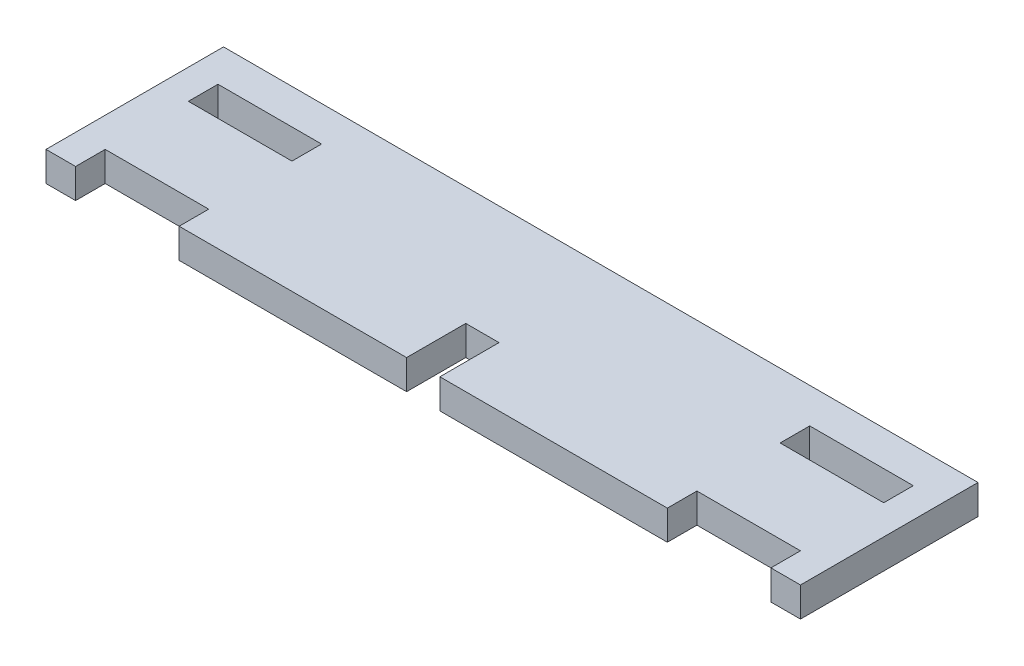
ISO-10303-21;
HEADER;
FILE_DESCRIPTION(('STEP AP214'),'2;1');
FILE_NAME('part.step','',(''),(''),'','','');
FILE_SCHEMA(('AUTOMOTIVE_DESIGN { 1 0 10303 214 1 1 1 1 }'));
ENDSEC;
DATA;
#1=APPLICATION_CONTEXT('core data for automotive mechanical design processes');
#2=APPLICATION_PROTOCOL_DEFINITION('international standard','automotive_design',2000,#1);
#3=PRODUCT_CONTEXT('',#1,'mechanical');
#4=PRODUCT('Part','Part','',(#3));
#5=PRODUCT_RELATED_PRODUCT_CATEGORY('part','',(#4));
#6=PRODUCT_DEFINITION_FORMATION('','',#4);
#7=PRODUCT_DEFINITION_CONTEXT('part definition',#1,'design');
#8=PRODUCT_DEFINITION('design','',#6,#7);
#9=PRODUCT_DEFINITION_SHAPE('','',#8);
#10=(LENGTH_UNIT() NAMED_UNIT(*) SI_UNIT(.MILLI.,.METRE.));
#11=(NAMED_UNIT(*) PLANE_ANGLE_UNIT() SI_UNIT($,.RADIAN.));
#12=(NAMED_UNIT(*) SI_UNIT($,.STERADIAN.) SOLID_ANGLE_UNIT());
#13=UNCERTAINTY_MEASURE_WITH_UNIT(LENGTH_MEASURE(1.E-05),#10,'distance_accuracy_value','');
#14=(GEOMETRIC_REPRESENTATION_CONTEXT(3) GLOBAL_UNCERTAINTY_ASSIGNED_CONTEXT((#13)) GLOBAL_UNIT_ASSIGNED_CONTEXT((#10,
#11,#12)) REPRESENTATION_CONTEXT('',''));
#15=CARTESIAN_POINT('',(0.,0.,0.));
#16=DIRECTION('',(0.,0.,1.));
#17=DIRECTION('',(1.,0.,0.));
#18=AXIS2_PLACEMENT_3D('',#15,#16,#17);
#19=CARTESIAN_POINT('',(0.,4.,3.99999999999994));
#20=DIRECTION('',(0.,0.,-1.));
#21=DIRECTION('',(-1.,0.,0.));
#22=AXIS2_PLACEMENT_3D('',#19,#20,#21);
#23=PLANE('',#22);
#24=DIRECTION('',(1.,0.,0.));
#25=VECTOR('',#24,1.);
#26=CARTESIAN_POINT('',(0.,0.,3.99999999999994));
#27=LINE('',#26,#25);
#28=CARTESIAN_POINT('',(-2.25,0.,3.99999999999994));
#29=VERTEX_POINT('',#28);
#30=CARTESIAN_POINT('',(2.25,0.,3.99999999999994));
#31=VERTEX_POINT('',#30);
#32=EDGE_CURVE('E317',#29,#31,#27,.T.);
#33=ORIENTED_EDGE('',*,*,#32,.T.);
#34=DIRECTION('',(0.,-1.,0.));
#35=VECTOR('',#34,1.);
#36=CARTESIAN_POINT('',(2.25,4.,3.99999999999994));
#37=LINE('',#36,#35);
#38=CARTESIAN_POINT('',(2.25,4.,3.99999999999994));
#39=VERTEX_POINT('',#38);
#40=EDGE_CURVE('E11',#39,#31,#37,.T.);
#41=ORIENTED_EDGE('',*,*,#40,.F.);
#42=DIRECTION('',(1.,0.,0.));
#43=VECTOR('',#42,1.);
#44=CARTESIAN_POINT('',(0.,4.,3.99999999999994));
#45=LINE('',#44,#43);
#46=CARTESIAN_POINT('',(-2.25,4.,3.99999999999994));
#47=VERTEX_POINT('',#46);
#48=EDGE_CURVE('E258',#47,#39,#45,.T.);
#49=ORIENTED_EDGE('',*,*,#48,.F.);
#50=DIRECTION('',(0.,-1.,0.));
#51=VECTOR('',#50,1.);
#52=CARTESIAN_POINT('',(-2.25,4.,3.99999999999994));
#53=LINE('',#52,#51);
#54=EDGE_CURVE('E59',#47,#29,#53,.T.);
#55=ORIENTED_EDGE('',*,*,#54,.T.);
#56=EDGE_LOOP('',(#33,#41,#49,#55));
#57=FACE_BOUND('',#56,.T.);
#58=ADVANCED_FACE('F39',(#57),#23,.F.);
#59=CARTESIAN_POINT('',(2.25,4.,0.));
#60=DIRECTION('',(1.,0.,0.));
#61=DIRECTION('',(0.,0.,-1.));
#62=AXIS2_PLACEMENT_3D('',#59,#60,#61);
#63=PLANE('',#62);
#64=DIRECTION('',(0.,0.,1.));
#65=VECTOR('',#64,1.);
#66=CARTESIAN_POINT('',(2.25,0.,0.));
#67=LINE('',#66,#65);
#68=CARTESIAN_POINT('',(2.25,0.,12.));
#69=VERTEX_POINT('',#68);
#70=EDGE_CURVE('E320',#31,#69,#67,.T.);
#71=ORIENTED_EDGE('',*,*,#70,.T.);
#72=DIRECTION('',(0.,-1.,0.));
#73=VECTOR('',#72,1.);
#74=CARTESIAN_POINT('',(2.25,4.,12.));
#75=LINE('',#74,#73);
#76=CARTESIAN_POINT('',(2.25,4.,12.));
#77=VERTEX_POINT('',#76);
#78=EDGE_CURVE('E50',#77,#69,#75,.T.);
#79=ORIENTED_EDGE('',*,*,#78,.F.);
#80=DIRECTION('',(0.,0.,1.));
#81=VECTOR('',#80,1.);
#82=CARTESIAN_POINT('',(2.25,4.,0.));
#83=LINE('',#82,#81);
#84=EDGE_CURVE('E250',#39,#77,#83,.T.);
#85=ORIENTED_EDGE('',*,*,#84,.F.);
#86=ORIENTED_EDGE('',*,*,#40,.T.);
#87=EDGE_LOOP('',(#71,#79,#85,#86));
#88=FACE_BOUND('',#87,.T.);
#89=ADVANCED_FACE('F460',(#88),#63,.F.);
#90=CARTESIAN_POINT('',(0.,4.,12.));
#91=DIRECTION('',(0.,0.,-1.));
#92=DIRECTION('',(-1.,0.,0.));
#93=AXIS2_PLACEMENT_3D('',#90,#91,#92);
#94=PLANE('',#93);
#95=DIRECTION('',(1.,0.,0.));
#96=VECTOR('',#95,1.);
#97=CARTESIAN_POINT('',(0.,0.,12.));
#98=LINE('',#97,#96);
#99=CARTESIAN_POINT('',(33.,0.,12.));
#100=VERTEX_POINT('',#99);
#101=EDGE_CURVE('E323',#69,#100,#98,.T.);
#102=ORIENTED_EDGE('',*,*,#101,.T.);
#103=DIRECTION('',(0.,-1.,0.));
#104=VECTOR('',#103,1.);
#105=CARTESIAN_POINT('',(33.,4.,12.));
#106=LINE('',#105,#104);
#107=CARTESIAN_POINT('',(33.,4.,12.));
#108=VERTEX_POINT('',#107);
#109=EDGE_CURVE('E403',#108,#100,#106,.T.);
#110=ORIENTED_EDGE('',*,*,#109,.F.);
#111=DIRECTION('',(1.,0.,0.));
#112=VECTOR('',#111,1.);
#113=CARTESIAN_POINT('',(0.,4.,12.));
#114=LINE('',#113,#112);
#115=EDGE_CURVE('E238',#77,#108,#114,.T.);
#116=ORIENTED_EDGE('',*,*,#115,.F.);
#117=ORIENTED_EDGE('',*,*,#78,.T.);
#118=EDGE_LOOP('',(#102,#110,#116,#117));
#119=FACE_BOUND('',#118,.T.);
#120=ADVANCED_FACE('F465',(#119),#94,.F.);
#121=CARTESIAN_POINT('',(33.,4.,0.));
#122=DIRECTION('',(1.,0.,0.));
#123=DIRECTION('',(0.,0.,-1.));
#124=AXIS2_PLACEMENT_3D('',#121,#122,#123);
#125=PLANE('',#124);
#126=DIRECTION('',(0.,0.,1.));
#127=VECTOR('',#126,1.);
#128=CARTESIAN_POINT('',(33.,0.,0.));
#129=LINE('',#128,#127);
#130=CARTESIAN_POINT('',(33.,0.,8.));
#131=VERTEX_POINT('',#130);
#132=EDGE_CURVE('E327',#131,#100,#129,.T.);
#133=ORIENTED_EDGE('',*,*,#132,.F.);
#134=DIRECTION('',(0.,-1.,0.));
#135=VECTOR('',#134,1.);
#136=CARTESIAN_POINT('',(33.,4.,8.));
#137=LINE('',#136,#135);
#138=CARTESIAN_POINT('',(33.,4.,8.));
#139=VERTEX_POINT('',#138);
#140=EDGE_CURVE('E400',#139,#131,#137,.T.);
#141=ORIENTED_EDGE('',*,*,#140,.F.);
#142=DIRECTION('',(0.,0.,1.));
#143=VECTOR('',#142,1.);
#144=CARTESIAN_POINT('',(33.,4.,0.));
#145=LINE('',#144,#143);
#146=EDGE_CURVE('E249',#139,#108,#145,.T.);
#147=ORIENTED_EDGE('',*,*,#146,.T.);
#148=ORIENTED_EDGE('',*,*,#109,.T.);
#149=EDGE_LOOP('',(#133,#141,#147,#148));
#150=FACE_BOUND('',#149,.T.);
#151=ADVANCED_FACE('F526',(#150),#125,.T.);
#152=CARTESIAN_POINT('',(0.,4.,8.));
#153=DIRECTION('',(0.,0.,-1.));
#154=DIRECTION('',(-1.,0.,0.));
#155=AXIS2_PLACEMENT_3D('',#152,#153,#154);
#156=PLANE('',#155);
#157=DIRECTION('',(1.,0.,0.));
#158=VECTOR('',#157,1.);
#159=CARTESIAN_POINT('',(0.,0.,8.));
#160=LINE('',#159,#158);
#161=CARTESIAN_POINT('',(47.,0.,8.));
#162=VERTEX_POINT('',#161);
#163=EDGE_CURVE('E333',#131,#162,#160,.T.);
#164=ORIENTED_EDGE('',*,*,#163,.T.);
#165=DIRECTION('',(0.,-1.,0.));
#166=VECTOR('',#165,1.);
#167=CARTESIAN_POINT('',(47.,4.,8.));
#168=LINE('',#167,#166);
#169=CARTESIAN_POINT('',(47.,4.,8.));
#170=VERTEX_POINT('',#169);
#171=EDGE_CURVE('E396',#170,#162,#168,.T.);
#172=ORIENTED_EDGE('',*,*,#171,.F.);
#173=DIRECTION('',(1.,0.,0.));
#174=VECTOR('',#173,1.);
#175=CARTESIAN_POINT('',(0.,4.,8.));
#176=LINE('',#175,#174);
#177=EDGE_CURVE('E257',#139,#170,#176,.T.);
#178=ORIENTED_EDGE('',*,*,#177,.F.);
#179=ORIENTED_EDGE('',*,*,#140,.T.);
#180=EDGE_LOOP('',(#164,#172,#178,#179));
#181=FACE_BOUND('',#180,.T.);
#182=ADVANCED_FACE('F523',(#181),#156,.F.);
#183=CARTESIAN_POINT('',(47.,4.,0.));
#184=DIRECTION('',(1.,0.,0.));
#185=DIRECTION('',(0.,0.,-1.));
#186=AXIS2_PLACEMENT_3D('',#183,#184,#185);
#187=PLANE('',#186);
#188=DIRECTION('',(0.,0.,1.));
#189=VECTOR('',#188,1.);
#190=CARTESIAN_POINT('',(47.,0.,0.));
#191=LINE('',#190,#189);
#192=CARTESIAN_POINT('',(47.,0.,12.));
#193=VERTEX_POINT('',#192);
#194=EDGE_CURVE('E336',#162,#193,#191,.T.);
#195=ORIENTED_EDGE('',*,*,#194,.T.);
#196=DIRECTION('',(0.,-1.,0.));
#197=VECTOR('',#196,1.);
#198=CARTESIAN_POINT('',(47.,4.,12.));
#199=LINE('',#198,#197);
#200=CARTESIAN_POINT('',(47.,4.,12.));
#201=VERTEX_POINT('',#200);
#202=EDGE_CURVE('E392',#201,#193,#199,.T.);
#203=ORIENTED_EDGE('',*,*,#202,.F.);
#204=DIRECTION('',(0.,0.,1.));
#205=VECTOR('',#204,1.);
#206=CARTESIAN_POINT('',(47.,4.,0.));
#207=LINE('',#206,#205);
#208=EDGE_CURVE('E261',#170,#201,#207,.T.);
#209=ORIENTED_EDGE('',*,*,#208,.F.);
#210=ORIENTED_EDGE('',*,*,#171,.T.);
#211=EDGE_LOOP('',(#195,#203,#209,#210));
#212=FACE_BOUND('',#211,.T.);
#213=ADVANCED_FACE('F520',(#212),#187,.F.);
#214=CARTESIAN_POINT('',(51.,0.,12.));
#215=VERTEX_POINT('',#214);
#216=EDGE_CURVE('E329',#193,#215,#98,.T.);
#217=ORIENTED_EDGE('',*,*,#216,.T.);
#218=DIRECTION('',(0.,-1.,0.));
#219=VECTOR('',#218,1.);
#220=CARTESIAN_POINT('',(51.,4.,12.));
#221=LINE('',#220,#219);
#222=CARTESIAN_POINT('',(51.,4.,12.));
#223=VERTEX_POINT('',#222);
#224=EDGE_CURVE('E389',#223,#215,#221,.T.);
#225=ORIENTED_EDGE('',*,*,#224,.F.);
#226=EDGE_CURVE('E247',#201,#223,#114,.T.);
#227=ORIENTED_EDGE('',*,*,#226,.F.);
#228=ORIENTED_EDGE('',*,*,#202,.T.);
#229=EDGE_LOOP('',(#217,#225,#227,#228));
#230=FACE_BOUND('',#229,.T.);
#231=ADVANCED_FACE('F518',(#230),#94,.F.);
#232=CARTESIAN_POINT('',(51.,4.,0.));
#233=DIRECTION('',(1.,0.,0.));
#234=DIRECTION('',(0.,0.,-1.));
#235=AXIS2_PLACEMENT_3D('',#232,#233,#234);
#236=PLANE('',#235);
#237=DIRECTION('',(0.,0.,1.));
#238=VECTOR('',#237,1.);
#239=CARTESIAN_POINT('',(51.,0.,0.));
#240=LINE('',#239,#238);
#241=CARTESIAN_POINT('',(51.,0.,-12.));
#242=VERTEX_POINT('',#241);
#243=EDGE_CURVE('E339',#242,#215,#240,.T.);
#244=ORIENTED_EDGE('',*,*,#243,.F.);
#245=DIRECTION('',(0.,-1.,0.));
#246=VECTOR('',#245,1.);
#247=CARTESIAN_POINT('',(51.,4.,-12.));
#248=LINE('',#247,#246);
#249=CARTESIAN_POINT('',(51.,4.,-12.));
#250=VERTEX_POINT('',#249);
#251=EDGE_CURVE('E386',#250,#242,#248,.T.);
#252=ORIENTED_EDGE('',*,*,#251,.F.);
#253=DIRECTION('',(0.,0.,1.));
#254=VECTOR('',#253,1.);
#255=CARTESIAN_POINT('',(51.,4.,0.));
#256=LINE('',#255,#254);
#257=EDGE_CURVE('E260',#250,#223,#256,.T.);
#258=ORIENTED_EDGE('',*,*,#257,.T.);
#259=ORIENTED_EDGE('',*,*,#224,.T.);
#260=EDGE_LOOP('',(#244,#252,#258,#259));
#261=FACE_BOUND('',#260,.T.);
#262=ADVANCED_FACE('F514',(#261),#236,.T.);
#263=CARTESIAN_POINT('',(0.,4.,-12.));
#264=DIRECTION('',(0.,0.,-1.));
#265=DIRECTION('',(-1.,0.,0.));
#266=AXIS2_PLACEMENT_3D('',#263,#264,#265);
#267=PLANE('',#266);
#268=DIRECTION('',(1.,0.,0.));
#269=VECTOR('',#268,1.);
#270=CARTESIAN_POINT('',(0.,0.,-12.));
#271=LINE('',#270,#269);
#272=CARTESIAN_POINT('',(-51.,0.,-12.));
#273=VERTEX_POINT('',#272);
#274=EDGE_CURVE('E343',#273,#242,#271,.T.);
#275=ORIENTED_EDGE('',*,*,#274,.F.);
#276=DIRECTION('',(0.,-1.,0.));
#277=VECTOR('',#276,1.);
#278=CARTESIAN_POINT('',(-51.,4.,-12.));
#279=LINE('',#278,#277);
#280=CARTESIAN_POINT('',(-51.,4.,-12.));
#281=VERTEX_POINT('',#280);
#282=EDGE_CURVE('E383',#281,#273,#279,.T.);
#283=ORIENTED_EDGE('',*,*,#282,.F.);
#284=DIRECTION('',(1.,0.,0.));
#285=VECTOR('',#284,1.);
#286=CARTESIAN_POINT('',(0.,4.,-12.));
#287=LINE('',#286,#285);
#288=EDGE_CURVE('E268',#281,#250,#287,.T.);
#289=ORIENTED_EDGE('',*,*,#288,.T.);
#290=ORIENTED_EDGE('',*,*,#251,.T.);
#291=EDGE_LOOP('',(#275,#283,#289,#290));
#292=FACE_BOUND('',#291,.T.);
#293=ADVANCED_FACE('F510',(#292),#267,.T.);
#294=CARTESIAN_POINT('',(-51.,4.,0.));
#295=DIRECTION('',(1.,0.,0.));
#296=DIRECTION('',(0.,0.,-1.));
#297=AXIS2_PLACEMENT_3D('',#294,#295,#296);
#298=PLANE('',#297);
#299=DIRECTION('',(0.,0.,1.));
#300=VECTOR('',#299,1.);
#301=CARTESIAN_POINT('',(-51.,0.,0.));
#302=LINE('',#301,#300);
#303=CARTESIAN_POINT('',(-51.,0.,12.));
#304=VERTEX_POINT('',#303);
#305=EDGE_CURVE('E347',#273,#304,#302,.T.);
#306=ORIENTED_EDGE('',*,*,#305,.T.);
#307=DIRECTION('',(0.,-1.,0.));
#308=VECTOR('',#307,1.);
#309=CARTESIAN_POINT('',(-51.,4.,12.));
#310=LINE('',#309,#308);
#311=CARTESIAN_POINT('',(-51.,4.,12.));
#312=VERTEX_POINT('',#311);
#313=EDGE_CURVE('E379',#312,#304,#310,.T.);
#314=ORIENTED_EDGE('',*,*,#313,.F.);
#315=DIRECTION('',(0.,0.,1.));
#316=VECTOR('',#315,1.);
#317=CARTESIAN_POINT('',(-51.,4.,0.));
#318=LINE('',#317,#316);
#319=EDGE_CURVE('E246',#281,#312,#318,.T.);
#320=ORIENTED_EDGE('',*,*,#319,.F.);
#321=ORIENTED_EDGE('',*,*,#282,.T.);
#322=EDGE_LOOP('',(#306,#314,#320,#321));
#323=FACE_BOUND('',#322,.T.);
#324=ADVANCED_FACE('F507',(#323),#298,.F.);
#325=CARTESIAN_POINT('',(-47.,0.,12.));
#326=VERTEX_POINT('',#325);
#327=EDGE_CURVE('E350',#304,#326,#98,.T.);
#328=ORIENTED_EDGE('',*,*,#327,.T.);
#329=DIRECTION('',(0.,-1.,0.));
#330=VECTOR('',#329,1.);
#331=CARTESIAN_POINT('',(-47.,4.,12.));
#332=LINE('',#331,#330);
#333=CARTESIAN_POINT('',(-47.,4.,12.));
#334=VERTEX_POINT('',#333);
#335=EDGE_CURVE('E376',#334,#326,#332,.T.);
#336=ORIENTED_EDGE('',*,*,#335,.F.);
#337=EDGE_CURVE('E237',#312,#334,#114,.T.);
#338=ORIENTED_EDGE('',*,*,#337,.F.);
#339=ORIENTED_EDGE('',*,*,#313,.T.);
#340=EDGE_LOOP('',(#328,#336,#338,#339));
#341=FACE_BOUND('',#340,.T.);
#342=ADVANCED_FACE('F496',(#341),#94,.F.);
#343=CARTESIAN_POINT('',(-47.,4.,0.));
#344=DIRECTION('',(1.,0.,0.));
#345=DIRECTION('',(0.,0.,-1.));
#346=AXIS2_PLACEMENT_3D('',#343,#344,#345);
#347=PLANE('',#346);
#348=DIRECTION('',(0.,0.,1.));
#349=VECTOR('',#348,1.);
#350=CARTESIAN_POINT('',(-47.,0.,0.));
#351=LINE('',#350,#349);
#352=CARTESIAN_POINT('',(-47.,0.,7.99999999999996));
#353=VERTEX_POINT('',#352);
#354=EDGE_CURVE('E351',#353,#326,#351,.T.);
#355=ORIENTED_EDGE('',*,*,#354,.F.);
#356=DIRECTION('',(0.,-1.,0.));
#357=VECTOR('',#356,1.);
#358=CARTESIAN_POINT('',(-47.,4.,7.99999999999996));
#359=LINE('',#358,#357);
#360=CARTESIAN_POINT('',(-47.,4.,7.99999999999996));
#361=VERTEX_POINT('',#360);
#362=EDGE_CURVE('E373',#361,#353,#359,.T.);
#363=ORIENTED_EDGE('',*,*,#362,.F.);
#364=DIRECTION('',(0.,0.,1.));
#365=VECTOR('',#364,1.);
#366=CARTESIAN_POINT('',(-47.,4.,0.));
#367=LINE('',#366,#365);
#368=EDGE_CURVE('E245',#361,#334,#367,.T.);
#369=ORIENTED_EDGE('',*,*,#368,.T.);
#370=ORIENTED_EDGE('',*,*,#335,.T.);
#371=EDGE_LOOP('',(#355,#363,#369,#370));
#372=FACE_BOUND('',#371,.T.);
#373=ADVANCED_FACE('F502',(#372),#347,.T.);
#374=CARTESIAN_POINT('',(0.,4.,7.99999999999999));
#375=DIRECTION('',(0.,0.,1.));
#376=DIRECTION('',(1.,0.,0.));
#377=AXIS2_PLACEMENT_3D('',#374,#375,#376);
#378=PLANE('',#377);
#379=DIRECTION('',(-1.,0.,0.));
#380=VECTOR('',#379,1.);
#381=CARTESIAN_POINT('',(0.,0.,7.99999999999999));
#382=LINE('',#381,#380);
#383=CARTESIAN_POINT('',(-33.,0.,7.99999999999997));
#384=VERTEX_POINT('',#383);
#385=EDGE_CURVE('E355',#384,#353,#382,.T.);
#386=ORIENTED_EDGE('',*,*,#385,.F.);
#387=DIRECTION('',(0.,-1.,0.));
#388=VECTOR('',#387,1.);
#389=CARTESIAN_POINT('',(-33.,4.,7.99999999999997));
#390=LINE('',#389,#388);
#391=CARTESIAN_POINT('',(-33.,4.,7.99999999999997));
#392=VERTEX_POINT('',#391);
#393=EDGE_CURVE('E231',#392,#384,#390,.T.);
#394=ORIENTED_EDGE('',*,*,#393,.F.);
#395=DIRECTION('',(-1.,0.,0.));
#396=VECTOR('',#395,1.);
#397=CARTESIAN_POINT('',(0.,4.,7.99999999999999));
#398=LINE('',#397,#396);
#399=EDGE_CURVE('E219',#392,#361,#398,.T.);
#400=ORIENTED_EDGE('',*,*,#399,.T.);
#401=ORIENTED_EDGE('',*,*,#362,.T.);
#402=EDGE_LOOP('',(#386,#394,#400,#401));
#403=FACE_BOUND('',#402,.T.);
#404=ADVANCED_FACE('F499',(#403),#378,.T.);
#405=CARTESIAN_POINT('',(-33.,4.,0.));
#406=DIRECTION('',(1.,0.,0.));
#407=DIRECTION('',(0.,0.,-1.));
#408=AXIS2_PLACEMENT_3D('',#405,#406,#407);
#409=PLANE('',#408);
#410=DIRECTION('',(0.,0.,1.));
#411=VECTOR('',#410,1.);
#412=CARTESIAN_POINT('',(-33.,0.,0.));
#413=LINE('',#412,#411);
#414=CARTESIAN_POINT('',(-33.,0.,12.));
#415=VERTEX_POINT('',#414);
#416=EDGE_CURVE('E227',#384,#415,#413,.T.);
#417=ORIENTED_EDGE('',*,*,#416,.T.);
#418=DIRECTION('',(0.,-1.,0.));
#419=VECTOR('',#418,1.);
#420=CARTESIAN_POINT('',(-33.,4.,12.));
#421=LINE('',#420,#419);
#422=CARTESIAN_POINT('',(-33.,4.,12.));
#423=VERTEX_POINT('',#422);
#424=EDGE_CURVE('E224',#423,#415,#421,.T.);
#425=ORIENTED_EDGE('',*,*,#424,.F.);
#426=DIRECTION('',(0.,0.,1.));
#427=VECTOR('',#426,1.);
#428=CARTESIAN_POINT('',(-33.,4.,0.));
#429=LINE('',#428,#427);
#430=EDGE_CURVE('E210',#392,#423,#429,.T.);
#431=ORIENTED_EDGE('',*,*,#430,.F.);
#432=ORIENTED_EDGE('',*,*,#393,.T.);
#433=EDGE_LOOP('',(#417,#425,#431,#432));
#434=FACE_BOUND('',#433,.T.);
#435=ADVANCED_FACE('F225',(#434),#409,.F.);
#436=CARTESIAN_POINT('',(-2.25,0.,12.));
#437=VERTEX_POINT('',#436);
#438=EDGE_CURVE('E328',#415,#437,#98,.T.);
#439=ORIENTED_EDGE('',*,*,#438,.T.);
#440=DIRECTION('',(0.,-1.,0.));
#441=VECTOR('',#440,1.);
#442=CARTESIAN_POINT('',(-2.25,4.,12.));
#443=LINE('',#442,#441);
#444=CARTESIAN_POINT('',(-2.25,4.,12.));
#445=VERTEX_POINT('',#444);
#446=EDGE_CURVE('E134',#445,#437,#443,.T.);
#447=ORIENTED_EDGE('',*,*,#446,.F.);
#448=EDGE_CURVE('E216',#423,#445,#114,.T.);
#449=ORIENTED_EDGE('',*,*,#448,.F.);
#450=ORIENTED_EDGE('',*,*,#424,.T.);
#451=EDGE_LOOP('',(#439,#447,#449,#450));
#452=FACE_BOUND('',#451,.T.);
#453=ADVANCED_FACE('F233',(#452),#94,.F.);
#454=CARTESIAN_POINT('',(0.,4.,-7.25));
#455=DIRECTION('',(0.,0.,-1.));
#456=DIRECTION('',(-1.,0.,0.));
#457=AXIS2_PLACEMENT_3D('',#454,#455,#456);
#458=PLANE('',#457);
#459=DIRECTION('',(1.,0.,0.));
#460=VECTOR('',#459,1.);
#461=CARTESIAN_POINT('',(0.,0.,-7.25));
#462=LINE('',#461,#460);
#463=CARTESIAN_POINT('',(33.,0.,-7.25));
#464=VERTEX_POINT('',#463);
#465=CARTESIAN_POINT('',(47.,0.,-7.25));
#466=VERTEX_POINT('',#465);
#467=EDGE_CURVE('E301',#464,#466,#462,.T.);
#468=ORIENTED_EDGE('',*,*,#467,.T.);
#469=DIRECTION('',(0.,-1.,0.));
#470=VECTOR('',#469,1.);
#471=CARTESIAN_POINT('',(47.,4.,-7.25));
#472=LINE('',#471,#470);
#473=CARTESIAN_POINT('',(47.,4.,-7.25));
#474=VERTEX_POINT('',#473);
#475=EDGE_CURVE('E368',#474,#466,#472,.T.);
#476=ORIENTED_EDGE('',*,*,#475,.F.);
#477=DIRECTION('',(1.,0.,0.));
#478=VECTOR('',#477,1.);
#479=CARTESIAN_POINT('',(0.,4.,-7.25));
#480=LINE('',#479,#478);
#481=CARTESIAN_POINT('',(33.,4.,-7.25));
#482=VERTEX_POINT('',#481);
#483=EDGE_CURVE('E569',#482,#474,#480,.T.);
#484=ORIENTED_EDGE('',*,*,#483,.F.);
#485=DIRECTION('',(0.,-1.,0.));
#486=VECTOR('',#485,1.);
#487=CARTESIAN_POINT('',(33.,4.,-7.25));
#488=LINE('',#487,#486);
#489=EDGE_CURVE('E409',#482,#464,#488,.T.);
#490=ORIENTED_EDGE('',*,*,#489,.T.);
#491=EDGE_LOOP('',(#468,#476,#484,#490));
#492=FACE_BOUND('',#491,.T.);
#493=ADVANCED_FACE('F477',(#492),#458,.F.);
#494=CARTESIAN_POINT('',(47.,4.,0.));
#495=DIRECTION('',(1.,0.,0.));
#496=DIRECTION('',(0.,0.,-1.));
#497=AXIS2_PLACEMENT_3D('',#494,#495,#496);
#498=PLANE('',#497);
#499=DIRECTION('',(0.,0.,1.));
#500=VECTOR('',#499,1.);
#501=CARTESIAN_POINT('',(47.,0.,0.));
#502=LINE('',#501,#500);
#503=CARTESIAN_POINT('',(47.,0.,-3.25));
#504=VERTEX_POINT('',#503);
#505=EDGE_CURVE('E305',#466,#504,#502,.T.);
#506=ORIENTED_EDGE('',*,*,#505,.T.);
#507=DIRECTION('',(0.,-1.,0.));
#508=VECTOR('',#507,1.);
#509=CARTESIAN_POINT('',(47.,4.,-3.25));
#510=LINE('',#509,#508);
#511=CARTESIAN_POINT('',(47.,4.,-3.25));
#512=VERTEX_POINT('',#511);
#513=EDGE_CURVE('E415',#512,#504,#510,.T.);
#514=ORIENTED_EDGE('',*,*,#513,.F.);
#515=DIRECTION('',(0.,0.,1.));
#516=VECTOR('',#515,1.);
#517=CARTESIAN_POINT('',(47.,4.,0.));
#518=LINE('',#517,#516);
#519=EDGE_CURVE('E573',#474,#512,#518,.T.);
#520=ORIENTED_EDGE('',*,*,#519,.F.);
#521=ORIENTED_EDGE('',*,*,#475,.T.);
#522=EDGE_LOOP('',(#506,#514,#520,#521));
#523=FACE_BOUND('',#522,.T.);
#524=ADVANCED_FACE('F473',(#523),#498,.F.);
#525=CARTESIAN_POINT('',(0.,4.,-3.25));
#526=DIRECTION('',(0.,0.,-1.));
#527=DIRECTION('',(-1.,0.,0.));
#528=AXIS2_PLACEMENT_3D('',#525,#526,#527);
#529=PLANE('',#528);
#530=DIRECTION('',(1.,0.,0.));
#531=VECTOR('',#530,1.);
#532=CARTESIAN_POINT('',(0.,0.,-3.25));
#533=LINE('',#532,#531);
#534=CARTESIAN_POINT('',(33.,0.,-3.25));
#535=VERTEX_POINT('',#534);
#536=EDGE_CURVE('E309',#535,#504,#533,.T.);
#537=ORIENTED_EDGE('',*,*,#536,.F.);
#538=DIRECTION('',(0.,-1.,0.));
#539=VECTOR('',#538,1.);
#540=CARTESIAN_POINT('',(33.,4.,-3.25));
#541=LINE('',#540,#539);
#542=CARTESIAN_POINT('',(33.,4.,-3.25));
#543=VERTEX_POINT('',#542);
#544=EDGE_CURVE('E412',#543,#535,#541,.T.);
#545=ORIENTED_EDGE('',*,*,#544,.F.);
#546=DIRECTION('',(1.,0.,0.));
#547=VECTOR('',#546,1.);
#548=CARTESIAN_POINT('',(0.,4.,-3.25));
#549=LINE('',#548,#547);
#550=EDGE_CURVE('E576',#543,#512,#549,.T.);
#551=ORIENTED_EDGE('',*,*,#550,.T.);
#552=ORIENTED_EDGE('',*,*,#513,.T.);
#553=EDGE_LOOP('',(#537,#545,#551,#552));
#554=FACE_BOUND('',#553,.T.);
#555=ADVANCED_FACE('F470',(#554),#529,.T.);
#556=CARTESIAN_POINT('',(0.,4.,-7.25000000000001));
#557=DIRECTION('',(0.,0.,1.));
#558=DIRECTION('',(1.,0.,0.));
#559=AXIS2_PLACEMENT_3D('',#556,#557,#558);
#560=PLANE('',#559);
#561=DIRECTION('',(-1.,0.,0.));
#562=VECTOR('',#561,1.);
#563=CARTESIAN_POINT('',(0.,0.,-7.25000000000001));
#564=LINE('',#563,#562);
#565=CARTESIAN_POINT('',(-33.,0.,-7.25000000000002));
#566=VERTEX_POINT('',#565);
#567=CARTESIAN_POINT('',(-47.,0.,-7.25000000000003));
#568=VERTEX_POINT('',#567);
#569=EDGE_CURVE('E286',#566,#568,#564,.T.);
#570=ORIENTED_EDGE('',*,*,#569,.F.);
#571=DIRECTION('',(0.,-1.,0.));
#572=VECTOR('',#571,1.);
#573=CARTESIAN_POINT('',(-33.,4.,-7.25000000000002));
#574=LINE('',#573,#572);
#575=CARTESIAN_POINT('',(-33.,4.,-7.25000000000002));
#576=VERTEX_POINT('',#575);
#577=EDGE_CURVE('E43',#576,#566,#574,.T.);
#578=ORIENTED_EDGE('',*,*,#577,.F.);
#579=DIRECTION('',(-1.,0.,0.));
#580=VECTOR('',#579,1.);
#581=CARTESIAN_POINT('',(0.,4.,-7.25000000000001));
#582=LINE('',#581,#580);
#583=CARTESIAN_POINT('',(-47.,4.,-7.25000000000003));
#584=VERTEX_POINT('',#583);
#585=EDGE_CURVE('E365',#576,#584,#582,.T.);
#586=ORIENTED_EDGE('',*,*,#585,.T.);
#587=DIRECTION('',(0.,-1.,0.));
#588=VECTOR('',#587,1.);
#589=CARTESIAN_POINT('',(-47.,4.,-7.25000000000003));
#590=LINE('',#589,#588);
#591=EDGE_CURVE('E240',#584,#568,#590,.T.);
#592=ORIENTED_EDGE('',*,*,#591,.T.);
#593=EDGE_LOOP('',(#570,#578,#586,#592));
#594=FACE_BOUND('',#593,.T.);
#595=ADVANCED_FACE('F41',(#594),#560,.T.);
#596=CARTESIAN_POINT('',(-33.,4.,0.));
#597=DIRECTION('',(1.,0.,0.));
#598=DIRECTION('',(0.,0.,-1.));
#599=AXIS2_PLACEMENT_3D('',#596,#597,#598);
#600=PLANE('',#599);
#601=DIRECTION('',(0.,0.,1.));
#602=VECTOR('',#601,1.);
#603=CARTESIAN_POINT('',(-33.,0.,0.));
#604=LINE('',#603,#602);
#605=CARTESIAN_POINT('',(-33.,0.,-3.25000000000003));
#606=VERTEX_POINT('',#605);
#607=EDGE_CURVE('E290',#566,#606,#604,.T.);
#608=ORIENTED_EDGE('',*,*,#607,.T.);
#609=DIRECTION('',(0.,-1.,0.));
#610=VECTOR('',#609,1.);
#611=CARTESIAN_POINT('',(-33.,4.,-3.25000000000003));
#612=LINE('',#611,#610);
#613=CARTESIAN_POINT('',(-33.,4.,-3.25000000000003));
#614=VERTEX_POINT('',#613);
#615=EDGE_CURVE('E425',#614,#606,#612,.T.);
#616=ORIENTED_EDGE('',*,*,#615,.F.);
#617=DIRECTION('',(0.,0.,1.));
#618=VECTOR('',#617,1.);
#619=CARTESIAN_POINT('',(-33.,4.,0.));
#620=LINE('',#619,#618);
#621=EDGE_CURVE('E436',#576,#614,#620,.T.);
#622=ORIENTED_EDGE('',*,*,#621,.F.);
#623=ORIENTED_EDGE('',*,*,#577,.T.);
#624=EDGE_LOOP('',(#608,#616,#622,#623));
#625=FACE_BOUND('',#624,.T.);
#626=ADVANCED_FACE('F435',(#625),#600,.F.);
#627=CARTESIAN_POINT('',(0.,4.,-3.25000000000002));
#628=DIRECTION('',(0.,0.,1.));
#629=DIRECTION('',(1.,0.,0.));
#630=AXIS2_PLACEMENT_3D('',#627,#628,#629);
#631=PLANE('',#630);
#632=DIRECTION('',(-1.,0.,0.));
#633=VECTOR('',#632,1.);
#634=CARTESIAN_POINT('',(0.,0.,-3.25000000000002));
#635=LINE('',#634,#633);
#636=CARTESIAN_POINT('',(-47.,0.,-3.25000000000003));
#637=VERTEX_POINT('',#636);
#638=EDGE_CURVE('E293',#606,#637,#635,.T.);
#639=ORIENTED_EDGE('',*,*,#638,.T.);
#640=DIRECTION('',(0.,-1.,0.));
#641=VECTOR('',#640,1.);
#642=CARTESIAN_POINT('',(-47.,4.,-3.25000000000003));
#643=LINE('',#642,#641);
#644=CARTESIAN_POINT('',(-47.,4.,-3.25000000000003));
#645=VERTEX_POINT('',#644);
#646=EDGE_CURVE('E423',#645,#637,#643,.T.);
#647=ORIENTED_EDGE('',*,*,#646,.F.);
#648=DIRECTION('',(-1.,0.,0.));
#649=VECTOR('',#648,1.);
#650=CARTESIAN_POINT('',(0.,4.,-3.25000000000002));
#651=LINE('',#650,#649);
#652=EDGE_CURVE('E564',#614,#645,#651,.T.);
#653=ORIENTED_EDGE('',*,*,#652,.F.);
#654=ORIENTED_EDGE('',*,*,#615,.T.);
#655=EDGE_LOOP('',(#639,#647,#653,#654));
#656=FACE_BOUND('',#655,.T.);
#657=ADVANCED_FACE('F448',(#656),#631,.F.);
#658=CARTESIAN_POINT('',(33.,4.,0.));
#659=DIRECTION('',(1.,0.,0.));
#660=DIRECTION('',(0.,0.,-1.));
#661=AXIS2_PLACEMENT_3D('',#658,#659,#660);
#662=PLANE('',#661);
#663=DIRECTION('',(0.,0.,1.));
#664=VECTOR('',#663,1.);
#665=CARTESIAN_POINT('',(33.,0.,0.));
#666=LINE('',#665,#664);
#667=EDGE_CURVE('E313',#464,#535,#666,.T.);
#668=ORIENTED_EDGE('',*,*,#667,.F.);
#669=ORIENTED_EDGE('',*,*,#489,.F.);
#670=DIRECTION('',(0.,0.,1.));
#671=VECTOR('',#670,1.);
#672=CARTESIAN_POINT('',(33.,4.,0.));
#673=LINE('',#672,#671);
#674=EDGE_CURVE('E580',#482,#543,#673,.T.);
#675=ORIENTED_EDGE('',*,*,#674,.T.);
#676=ORIENTED_EDGE('',*,*,#544,.T.);
#677=EDGE_LOOP('',(#668,#669,#675,#676));
#678=FACE_BOUND('',#677,.T.);
#679=ADVANCED_FACE('F450',(#678),#662,.T.);
#680=CARTESIAN_POINT('',(-47.,4.,0.));
#681=DIRECTION('',(1.,0.,0.));
#682=DIRECTION('',(0.,0.,-1.));
#683=AXIS2_PLACEMENT_3D('',#680,#681,#682);
#684=PLANE('',#683);
#685=DIRECTION('',(0.,0.,1.));
#686=VECTOR('',#685,1.);
#687=CARTESIAN_POINT('',(-47.,0.,0.));
#688=LINE('',#687,#686);
#689=EDGE_CURVE('E297',#568,#637,#688,.T.);
#690=ORIENTED_EDGE('',*,*,#689,.F.);
#691=ORIENTED_EDGE('',*,*,#591,.F.);
#692=DIRECTION('',(0.,0.,1.));
#693=VECTOR('',#692,1.);
#694=CARTESIAN_POINT('',(-47.,4.,0.));
#695=LINE('',#694,#693);
#696=EDGE_CURVE('E446',#584,#645,#695,.T.);
#697=ORIENTED_EDGE('',*,*,#696,.T.);
#698=ORIENTED_EDGE('',*,*,#646,.T.);
#699=EDGE_LOOP('',(#690,#691,#697,#698));
#700=FACE_BOUND('',#699,.T.);
#701=ADVANCED_FACE('F445',(#700),#684,.T.);
#702=CARTESIAN_POINT('',(-2.25,4.,0.));
#703=DIRECTION('',(1.,0.,0.));
#704=DIRECTION('',(0.,0.,-1.));
#705=AXIS2_PLACEMENT_3D('',#702,#703,#704);
#706=PLANE('',#705);
#707=DIRECTION('',(0.,0.,1.));
#708=VECTOR('',#707,1.);
#709=CARTESIAN_POINT('',(-2.25,0.,0.));
#710=LINE('',#709,#708);
#711=EDGE_CURVE('E361',#29,#437,#710,.T.);
#712=ORIENTED_EDGE('',*,*,#711,.F.);
#713=ORIENTED_EDGE('',*,*,#54,.F.);
#714=DIRECTION('',(0.,0.,1.));
#715=VECTOR('',#714,1.);
#716=CARTESIAN_POINT('',(-2.25,4.,0.));
#717=LINE('',#716,#715);
#718=EDGE_CURVE('E235',#47,#445,#717,.T.);
#719=ORIENTED_EDGE('',*,*,#718,.T.);
#720=ORIENTED_EDGE('',*,*,#446,.T.);
#721=EDGE_LOOP('',(#712,#713,#719,#720));
#722=FACE_BOUND('',#721,.T.);
#723=ADVANCED_FACE('F482',(#722),#706,.T.);
#724=CARTESIAN_POINT('',(0.,4.,0.));
#725=DIRECTION('',(0.,1.,0.));
#726=DIRECTION('',(0.,0.,1.));
#727=AXIS2_PLACEMENT_3D('',#724,#725,#726);
#728=PLANE('',#727);
#729=ORIENTED_EDGE('',*,*,#585,.F.);
#730=ORIENTED_EDGE('',*,*,#621,.T.);
#731=ORIENTED_EDGE('',*,*,#652,.T.);
#732=ORIENTED_EDGE('',*,*,#696,.F.);
#733=EDGE_LOOP('',(#729,#730,#731,#732));
#734=FACE_BOUND('',#733,.T.);
#735=ORIENTED_EDGE('',*,*,#483,.T.);
#736=ORIENTED_EDGE('',*,*,#519,.T.);
#737=ORIENTED_EDGE('',*,*,#550,.F.);
#738=ORIENTED_EDGE('',*,*,#674,.F.);
#739=EDGE_LOOP('',(#735,#736,#737,#738));
#740=FACE_BOUND('',#739,.T.);
#741=ORIENTED_EDGE('',*,*,#48,.T.);
#742=ORIENTED_EDGE('',*,*,#84,.T.);
#743=ORIENTED_EDGE('',*,*,#115,.T.);
#744=ORIENTED_EDGE('',*,*,#146,.F.);
#745=ORIENTED_EDGE('',*,*,#177,.T.);
#746=ORIENTED_EDGE('',*,*,#208,.T.);
#747=ORIENTED_EDGE('',*,*,#226,.T.);
#748=ORIENTED_EDGE('',*,*,#257,.F.);
#749=ORIENTED_EDGE('',*,*,#288,.F.);
#750=ORIENTED_EDGE('',*,*,#319,.T.);
#751=ORIENTED_EDGE('',*,*,#337,.T.);
#752=ORIENTED_EDGE('',*,*,#368,.F.);
#753=ORIENTED_EDGE('',*,*,#399,.F.);
#754=ORIENTED_EDGE('',*,*,#430,.T.);
#755=ORIENTED_EDGE('',*,*,#448,.T.);
#756=ORIENTED_EDGE('',*,*,#718,.F.);
#757=EDGE_LOOP('',(#741,#742,#743,#744,#745,#746,#747,#748,#749,#750,#751,#752,#753,#754,#755,#756));
#758=FACE_BOUND('',#757,.T.);
#759=ADVANCED_FACE('F213',(#734,#740,#758),#728,.T.);
#760=CARTESIAN_POINT('',(0.,0.,0.));
#761=DIRECTION('',(0.,1.,0.));
#762=DIRECTION('',(0.,0.,1.));
#763=AXIS2_PLACEMENT_3D('',#760,#761,#762);
#764=PLANE('',#763);
#765=ORIENTED_EDGE('',*,*,#569,.T.);
#766=ORIENTED_EDGE('',*,*,#689,.T.);
#767=ORIENTED_EDGE('',*,*,#638,.F.);
#768=ORIENTED_EDGE('',*,*,#607,.F.);
#769=EDGE_LOOP('',(#765,#766,#767,#768));
#770=FACE_BOUND('',#769,.T.);
#771=ORIENTED_EDGE('',*,*,#467,.F.);
#772=ORIENTED_EDGE('',*,*,#667,.T.);
#773=ORIENTED_EDGE('',*,*,#536,.T.);
#774=ORIENTED_EDGE('',*,*,#505,.F.);
#775=EDGE_LOOP('',(#771,#772,#773,#774));
#776=FACE_BOUND('',#775,.T.);
#777=ORIENTED_EDGE('',*,*,#32,.F.);
#778=ORIENTED_EDGE('',*,*,#711,.T.);
#779=ORIENTED_EDGE('',*,*,#438,.F.);
#780=ORIENTED_EDGE('',*,*,#416,.F.);
#781=ORIENTED_EDGE('',*,*,#385,.T.);
#782=ORIENTED_EDGE('',*,*,#354,.T.);
#783=ORIENTED_EDGE('',*,*,#327,.F.);
#784=ORIENTED_EDGE('',*,*,#305,.F.);
#785=ORIENTED_EDGE('',*,*,#274,.T.);
#786=ORIENTED_EDGE('',*,*,#243,.T.);
#787=ORIENTED_EDGE('',*,*,#216,.F.);
#788=ORIENTED_EDGE('',*,*,#194,.F.);
#789=ORIENTED_EDGE('',*,*,#163,.F.);
#790=ORIENTED_EDGE('',*,*,#132,.T.);
#791=ORIENTED_EDGE('',*,*,#101,.F.);
#792=ORIENTED_EDGE('',*,*,#70,.F.);
#793=EDGE_LOOP('',(#777,#778,#779,#780,#781,#782,#783,#784,#785,#786,#787,#788,#789,#790,#791,#792));
#794=FACE_BOUND('',#793,.T.);
#795=ADVANCED_FACE('F439',(#770,#776,#794),#764,.F.);
#796=CLOSED_SHELL('',(#58,#89,#120,#151,#182,#213,#231,#262,#293,#324,#342,#373,#404,#435,#453,
#493,#524,#555,#595,#626,#657,#679,#701,#723,#759,#795));
#797=MANIFOLD_SOLID_BREP('B2',#796);
#798=ADVANCED_BREP_SHAPE_REPRESENTATION('',(#18,#797),#14);
#799=SHAPE_DEFINITION_REPRESENTATION(#9,#798);
ENDSEC;
END-ISO-10303-21;
